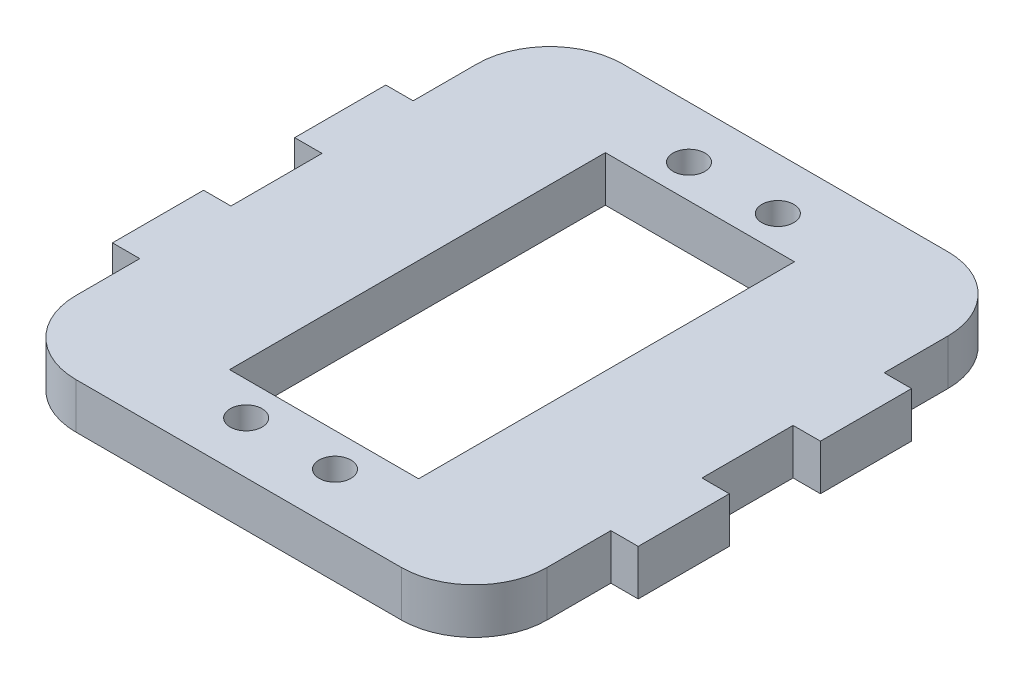
ISO-10303-21;
HEADER;
FILE_DESCRIPTION(('STEP AP214'),'2;1');
FILE_NAME('part.step','',(''),(''),'','','');
FILE_SCHEMA(('AUTOMOTIVE_DESIGN { 1 0 10303 214 1 1 1 1 }'));
ENDSEC;
DATA;
#1=APPLICATION_CONTEXT('core data for automotive mechanical design processes');
#2=APPLICATION_PROTOCOL_DEFINITION('international standard','automotive_design',2000,#1);
#3=PRODUCT_CONTEXT('',#1,'mechanical');
#4=PRODUCT('Part','Part','',(#3));
#5=PRODUCT_RELATED_PRODUCT_CATEGORY('part','',(#4));
#6=PRODUCT_DEFINITION_FORMATION('','',#4);
#7=PRODUCT_DEFINITION_CONTEXT('part definition',#1,'design');
#8=PRODUCT_DEFINITION('design','',#6,#7);
#9=PRODUCT_DEFINITION_SHAPE('','',#8);
#10=(LENGTH_UNIT() NAMED_UNIT(*) SI_UNIT(.MILLI.,.METRE.));
#11=(NAMED_UNIT(*) PLANE_ANGLE_UNIT() SI_UNIT($,.RADIAN.));
#12=(NAMED_UNIT(*) SI_UNIT($,.STERADIAN.) SOLID_ANGLE_UNIT());
#13=UNCERTAINTY_MEASURE_WITH_UNIT(LENGTH_MEASURE(1.E-05),#10,'distance_accuracy_value','');
#14=(GEOMETRIC_REPRESENTATION_CONTEXT(3) GLOBAL_UNCERTAINTY_ASSIGNED_CONTEXT((#13)) GLOBAL_UNIT_ASSIGNED_CONTEXT((#10,
#11,#12)) REPRESENTATION_CONTEXT('',''));
#15=CARTESIAN_POINT('',(0.,0.,0.));
#16=DIRECTION('',(0.,0.,1.));
#17=DIRECTION('',(1.,0.,0.));
#18=AXIS2_PLACEMENT_3D('',#15,#16,#17);
#19=CARTESIAN_POINT('',(0.,5.,0.));
#20=DIRECTION('',(0.,1.,0.));
#21=DIRECTION('',(0.,0.,1.));
#22=AXIS2_PLACEMENT_3D('',#19,#20,#21);
#23=PLANE('',#22);
#24=CARTESIAN_POINT('',(4.87500000000017,5.,-24.3));
#25=DIRECTION('',(0.,1.,0.));
#26=DIRECTION('',(0.,0.,1.));
#27=AXIS2_PLACEMENT_3D('',#24,#25,#26);
#28=CIRCLE('',#27,1.75);
#29=CARTESIAN_POINT('',(4.87500000000017,5.,-22.55));
#30=VERTEX_POINT('',#29);
#31=EDGE_CURVE('E928',#30,#30,#28,.T.);
#32=ORIENTED_EDGE('',*,*,#31,.F.);
#33=EDGE_LOOP('',(#32));
#34=FACE_BOUND('',#33,.T.);
#35=CARTESIAN_POINT('',(-4.875,5.,24.3));
#36=DIRECTION('',(0.,1.,0.));
#37=DIRECTION('',(0.,0.,1.));
#38=AXIS2_PLACEMENT_3D('',#35,#36,#37);
#39=CIRCLE('',#38,1.75);
#40=CARTESIAN_POINT('',(-4.875,5.,26.05));
#41=VERTEX_POINT('',#40);
#42=EDGE_CURVE('E265',#41,#41,#39,.T.);
#43=ORIENTED_EDGE('',*,*,#42,.F.);
#44=EDGE_LOOP('',(#43));
#45=FACE_BOUND('',#44,.T.);
#46=DIRECTION('',(1.,0.,0.));
#47=VECTOR('',#46,1.);
#48=CARTESIAN_POINT('',(25.8500000000002,5.,29.9999999999998));
#49=LINE('',#48,#47);
#50=CARTESIAN_POINT('',(-17.85,5.,30.));
#51=VERTEX_POINT('',#50);
#52=CARTESIAN_POINT('',(17.8500000000002,5.,29.9999999999998));
#53=VERTEX_POINT('',#52);
#54=EDGE_CURVE('E286',#51,#53,#49,.T.);
#55=ORIENTED_EDGE('',*,*,#54,.T.);
#56=CARTESIAN_POINT('',(17.8500000000002,5.,21.9999999999998));
#57=DIRECTION('',(0.,1.,0.));
#58=DIRECTION('',(0.,0.,1.));
#59=AXIS2_PLACEMENT_3D('',#56,#57,#58);
#60=CIRCLE('',#59,8.);
#61=CARTESIAN_POINT('',(25.8500000000002,5.,21.9999999999998));
#62=VERTEX_POINT('',#61);
#63=EDGE_CURVE('E502',#53,#62,#60,.T.);
#64=ORIENTED_EDGE('',*,*,#63,.T.);
#65=DIRECTION('',(0.,0.,-1.));
#66=VECTOR('',#65,1.);
#67=CARTESIAN_POINT('',(25.8500000000002,5.,29.9999999999998));
#68=LINE('',#67,#66);
#69=CARTESIAN_POINT('',(25.8500000000001,5.,14.9999999999998));
#70=VERTEX_POINT('',#69);
#71=EDGE_CURVE('E291',#62,#70,#68,.T.);
#72=ORIENTED_EDGE('',*,*,#71,.T.);
#73=DIRECTION('',(1.,0.,0.));
#74=VECTOR('',#73,1.);
#75=CARTESIAN_POINT('',(25.8500000000001,5.,14.9999999999998));
#76=LINE('',#75,#74);
#77=CARTESIAN_POINT('',(28.8500000000001,5.,14.9999999999998));
#78=VERTEX_POINT('',#77);
#79=EDGE_CURVE('E294',#70,#78,#76,.T.);
#80=ORIENTED_EDGE('',*,*,#79,.T.);
#81=DIRECTION('',(0.,0.,-1.));
#82=VECTOR('',#81,1.);
#83=CARTESIAN_POINT('',(28.8500000000001,5.,14.9999999999998));
#84=LINE('',#83,#82);
#85=CARTESIAN_POINT('',(28.85,5.,4.99999999999978));
#86=VERTEX_POINT('',#85);
#87=EDGE_CURVE('E297',#78,#86,#84,.T.);
#88=ORIENTED_EDGE('',*,*,#87,.T.);
#89=DIRECTION('',(-1.,0.,0.));
#90=VECTOR('',#89,1.);
#91=CARTESIAN_POINT('',(28.85,5.,4.99999999999978));
#92=LINE('',#91,#90);
#93=CARTESIAN_POINT('',(25.85,5.,4.99999999999978));
#94=VERTEX_POINT('',#93);
#95=EDGE_CURVE('E300',#86,#94,#92,.T.);
#96=ORIENTED_EDGE('',*,*,#95,.T.);
#97=DIRECTION('',(0.,0.,-1.));
#98=VECTOR('',#97,1.);
#99=CARTESIAN_POINT('',(25.85,5.,4.99999999999978));
#100=LINE('',#99,#98);
#101=CARTESIAN_POINT('',(25.85,5.,-5.00000000000022));
#102=VERTEX_POINT('',#101);
#103=EDGE_CURVE('E303',#94,#102,#100,.T.);
#104=ORIENTED_EDGE('',*,*,#103,.T.);
#105=DIRECTION('',(1.,0.,0.));
#106=VECTOR('',#105,1.);
#107=CARTESIAN_POINT('',(28.85,5.,-5.00000000000022));
#108=LINE('',#107,#106);
#109=CARTESIAN_POINT('',(28.85,5.,-5.00000000000022));
#110=VERTEX_POINT('',#109);
#111=EDGE_CURVE('E306',#102,#110,#108,.T.);
#112=ORIENTED_EDGE('',*,*,#111,.T.);
#113=DIRECTION('',(0.,0.,-1.));
#114=VECTOR('',#113,1.);
#115=CARTESIAN_POINT('',(28.8499999999999,5.,-15.0000000000002));
#116=LINE('',#115,#114);
#117=CARTESIAN_POINT('',(28.8499999999999,5.,-15.0000000000002));
#118=VERTEX_POINT('',#117);
#119=EDGE_CURVE('E309',#110,#118,#116,.T.);
#120=ORIENTED_EDGE('',*,*,#119,.T.);
#121=DIRECTION('',(-1.,0.,0.));
#122=VECTOR('',#121,1.);
#123=CARTESIAN_POINT('',(25.8499999999999,5.,-15.0000000000002));
#124=LINE('',#123,#122);
#125=CARTESIAN_POINT('',(25.8499999999999,5.,-15.0000000000002));
#126=VERTEX_POINT('',#125);
#127=EDGE_CURVE('E312',#118,#126,#124,.T.);
#128=ORIENTED_EDGE('',*,*,#127,.T.);
#129=DIRECTION('',(0.,0.,-1.));
#130=VECTOR('',#129,1.);
#131=CARTESIAN_POINT('',(25.8499999999999,5.,-15.0000000000002));
#132=LINE('',#131,#130);
#133=CARTESIAN_POINT('',(25.8499999999999,5.,-22.0000000000002));
#134=VERTEX_POINT('',#133);
#135=EDGE_CURVE('E315',#126,#134,#132,.T.);
#136=ORIENTED_EDGE('',*,*,#135,.T.);
#137=CARTESIAN_POINT('',(17.8499999999999,5.,-22.0000000000002));
#138=DIRECTION('',(0.,1.,0.));
#139=DIRECTION('',(0.,0.,1.));
#140=AXIS2_PLACEMENT_3D('',#137,#138,#139);
#141=CIRCLE('',#140,8.);
#142=CARTESIAN_POINT('',(17.8499999999998,5.,-30.0000000000002));
#143=VERTEX_POINT('',#142);
#144=EDGE_CURVE('E494',#134,#143,#141,.T.);
#145=ORIENTED_EDGE('',*,*,#144,.T.);
#146=DIRECTION('',(-1.,0.,0.));
#147=VECTOR('',#146,1.);
#148=CARTESIAN_POINT('',(25.8499999999998,5.,-30.0000000000002));
#149=LINE('',#148,#147);
#150=CARTESIAN_POINT('',(-17.85,5.,-30.));
#151=VERTEX_POINT('',#150);
#152=EDGE_CURVE('E319',#143,#151,#149,.T.);
#153=ORIENTED_EDGE('',*,*,#152,.T.);
#154=CARTESIAN_POINT('',(-17.85,5.,-22.));
#155=DIRECTION('',(0.,1.,0.));
#156=DIRECTION('',(0.,0.,1.));
#157=AXIS2_PLACEMENT_3D('',#154,#155,#156);
#158=CIRCLE('',#157,8.);
#159=CARTESIAN_POINT('',(-25.85,5.,-22.));
#160=VERTEX_POINT('',#159);
#161=EDGE_CURVE('E55',#151,#160,#158,.T.);
#162=ORIENTED_EDGE('',*,*,#161,.T.);
#163=DIRECTION('',(0.,0.,1.));
#164=VECTOR('',#163,1.);
#165=CARTESIAN_POINT('',(-25.85,5.,-15.));
#166=LINE('',#165,#164);
#167=CARTESIAN_POINT('',(-25.85,5.,-15.));
#168=VERTEX_POINT('',#167);
#169=EDGE_CURVE('E322',#160,#168,#166,.T.);
#170=ORIENTED_EDGE('',*,*,#169,.T.);
#171=DIRECTION('',(-1.,0.,0.));
#172=VECTOR('',#171,1.);
#173=CARTESIAN_POINT('',(-25.85,5.,-15.));
#174=LINE('',#173,#172);
#175=CARTESIAN_POINT('',(-28.85,5.,-15.));
#176=VERTEX_POINT('',#175);
#177=EDGE_CURVE('E325',#168,#176,#174,.T.);
#178=ORIENTED_EDGE('',*,*,#177,.T.);
#179=DIRECTION('',(0.,0.,1.));
#180=VECTOR('',#179,1.);
#181=CARTESIAN_POINT('',(-28.85,5.,-15.));
#182=LINE('',#181,#180);
#183=CARTESIAN_POINT('',(-28.85,5.,-5.));
#184=VERTEX_POINT('',#183);
#185=EDGE_CURVE('E328',#176,#184,#182,.T.);
#186=ORIENTED_EDGE('',*,*,#185,.T.);
#187=DIRECTION('',(1.,0.,0.));
#188=VECTOR('',#187,1.);
#189=CARTESIAN_POINT('',(-28.85,5.,-5.));
#190=LINE('',#189,#188);
#191=CARTESIAN_POINT('',(-25.85,5.,-5.));
#192=VERTEX_POINT('',#191);
#193=EDGE_CURVE('E331',#184,#192,#190,.T.);
#194=ORIENTED_EDGE('',*,*,#193,.T.);
#195=DIRECTION('',(0.,0.,1.));
#196=VECTOR('',#195,1.);
#197=CARTESIAN_POINT('',(-25.85,5.,5.));
#198=LINE('',#197,#196);
#199=CARTESIAN_POINT('',(-25.85,5.,5.));
#200=VERTEX_POINT('',#199);
#201=EDGE_CURVE('E334',#192,#200,#198,.T.);
#202=ORIENTED_EDGE('',*,*,#201,.T.);
#203=DIRECTION('',(-1.,0.,0.));
#204=VECTOR('',#203,1.);
#205=CARTESIAN_POINT('',(-28.85,5.,5.));
#206=LINE('',#205,#204);
#207=CARTESIAN_POINT('',(-28.85,5.,5.));
#208=VERTEX_POINT('',#207);
#209=EDGE_CURVE('E337',#200,#208,#206,.T.);
#210=ORIENTED_EDGE('',*,*,#209,.T.);
#211=DIRECTION('',(0.,0.,1.));
#212=VECTOR('',#211,1.);
#213=CARTESIAN_POINT('',(-28.85,5.,15.));
#214=LINE('',#213,#212);
#215=CARTESIAN_POINT('',(-28.85,5.,15.));
#216=VERTEX_POINT('',#215);
#217=EDGE_CURVE('E340',#208,#216,#214,.T.);
#218=ORIENTED_EDGE('',*,*,#217,.T.);
#219=DIRECTION('',(1.,0.,0.));
#220=VECTOR('',#219,1.);
#221=CARTESIAN_POINT('',(-25.85,5.,15.));
#222=LINE('',#221,#220);
#223=CARTESIAN_POINT('',(-25.85,5.,15.));
#224=VERTEX_POINT('',#223);
#225=EDGE_CURVE('E343',#216,#224,#222,.T.);
#226=ORIENTED_EDGE('',*,*,#225,.T.);
#227=DIRECTION('',(0.,0.,1.));
#228=VECTOR('',#227,1.);
#229=CARTESIAN_POINT('',(-25.85,5.,30.));
#230=LINE('',#229,#228);
#231=CARTESIAN_POINT('',(-25.85,5.,22.));
#232=VERTEX_POINT('',#231);
#233=EDGE_CURVE('E282',#224,#232,#230,.T.);
#234=ORIENTED_EDGE('',*,*,#233,.T.);
#235=CARTESIAN_POINT('',(-17.85,5.,22.));
#236=DIRECTION('',(0.,1.,0.));
#237=DIRECTION('',(0.,0.,1.));
#238=AXIS2_PLACEMENT_3D('',#235,#236,#237);
#239=CIRCLE('',#238,8.);
#240=EDGE_CURVE('E499',#232,#51,#239,.T.);
#241=ORIENTED_EDGE('',*,*,#240,.T.);
#242=EDGE_LOOP('',(#55,#64,#72,#80,#88,#96,#104,#112,#120,#128,#136,#145,#153,#162,#170,#178,
#186,#194,#202,#210,#218,#226,#234,#241));
#243=FACE_BOUND('',#242,.T.);
#244=DIRECTION('',(-1.,0.,0.));
#245=VECTOR('',#244,1.);
#246=CARTESIAN_POINT('',(-10.375,5.,-20.625));
#247=LINE('',#246,#245);
#248=CARTESIAN_POINT('',(10.3749999999999,5.,-20.6250000000001));
#249=VERTEX_POINT('',#248);
#250=CARTESIAN_POINT('',(-10.375,5.,-20.625));
#251=VERTEX_POINT('',#250);
#252=EDGE_CURVE('E237',#249,#251,#247,.T.);
#253=ORIENTED_EDGE('',*,*,#252,.F.);
#254=DIRECTION('',(0.,0.,-1.));
#255=VECTOR('',#254,1.);
#256=CARTESIAN_POINT('',(10.3749999999999,5.,-20.6250000000001));
#257=LINE('',#256,#255);
#258=CARTESIAN_POINT('',(10.3750000000001,5.,20.6249999999999));
#259=VERTEX_POINT('',#258);
#260=EDGE_CURVE('E226',#259,#249,#257,.T.);
#261=ORIENTED_EDGE('',*,*,#260,.F.);
#262=DIRECTION('',(1.,0.,0.));
#263=VECTOR('',#262,1.);
#264=CARTESIAN_POINT('',(-10.375,5.,20.625));
#265=LINE('',#264,#263);
#266=CARTESIAN_POINT('',(-10.375,5.,20.625));
#267=VERTEX_POINT('',#266);
#268=EDGE_CURVE('E256',#267,#259,#265,.T.);
#269=ORIENTED_EDGE('',*,*,#268,.F.);
#270=DIRECTION('',(0.,0.,1.));
#271=VECTOR('',#270,1.);
#272=CARTESIAN_POINT('',(-10.375,5.,-20.625));
#273=LINE('',#272,#271);
#274=EDGE_CURVE('E252',#251,#267,#273,.T.);
#275=ORIENTED_EDGE('',*,*,#274,.F.);
#276=EDGE_LOOP('',(#253,#261,#269,#275));
#277=FACE_BOUND('',#276,.T.);
#278=CARTESIAN_POINT('',(4.87500000000017,5.,24.3));
#279=DIRECTION('',(0.,1.,0.));
#280=DIRECTION('',(0.,0.,-1.));
#281=AXIS2_PLACEMENT_3D('',#278,#279,#280);
#282=CIRCLE('',#281,1.75);
#283=CARTESIAN_POINT('',(4.87500000000017,5.,22.55));
#284=VERTEX_POINT('',#283);
#285=EDGE_CURVE('E936',#284,#284,#282,.T.);
#286=ORIENTED_EDGE('',*,*,#285,.F.);
#287=EDGE_LOOP('',(#286));
#288=FACE_BOUND('',#287,.T.);
#289=CARTESIAN_POINT('',(-4.875,5.,-24.3));
#290=DIRECTION('',(0.,1.,0.));
#291=DIRECTION('',(0.,0.,-1.));
#292=AXIS2_PLACEMENT_3D('',#289,#290,#291);
#293=CIRCLE('',#292,1.75);
#294=CARTESIAN_POINT('',(-4.875,5.,-26.05));
#295=VERTEX_POINT('',#294);
#296=EDGE_CURVE('E917',#295,#295,#293,.T.);
#297=ORIENTED_EDGE('',*,*,#296,.F.);
#298=EDGE_LOOP('',(#297));
#299=FACE_BOUND('',#298,.T.);
#300=ADVANCED_FACE('F39',(#34,#45,#243,#277,#288,#299),#23,.T.);
#301=CARTESIAN_POINT('',(0.,0.,0.));
#302=DIRECTION('',(0.,1.,0.));
#303=DIRECTION('',(0.,0.,1.));
#304=AXIS2_PLACEMENT_3D('',#301,#302,#303);
#305=PLANE('',#304);
#306=DIRECTION('',(0.,0.,-1.));
#307=VECTOR('',#306,1.);
#308=CARTESIAN_POINT('',(25.8500000000002,0.,29.9999999999998));
#309=LINE('',#308,#307);
#310=CARTESIAN_POINT('',(25.8500000000002,0.,21.9999999999998));
#311=VERTEX_POINT('',#310);
#312=CARTESIAN_POINT('',(25.8500000000001,0.,14.9999999999998));
#313=VERTEX_POINT('',#312);
#314=EDGE_CURVE('E354',#311,#313,#309,.T.);
#315=ORIENTED_EDGE('',*,*,#314,.F.);
#316=CARTESIAN_POINT('',(17.8500000000002,0.,21.9999999999998));
#317=DIRECTION('',(0.,1.,0.));
#318=DIRECTION('',(0.,0.,1.));
#319=AXIS2_PLACEMENT_3D('',#316,#317,#318);
#320=CIRCLE('',#319,8.);
#321=CARTESIAN_POINT('',(17.8500000000002,0.,29.9999999999998));
#322=VERTEX_POINT('',#321);
#323=EDGE_CURVE('E484',#311,#322,#320,.F.);
#324=ORIENTED_EDGE('',*,*,#323,.T.);
#325=DIRECTION('',(1.,0.,0.));
#326=VECTOR('',#325,1.);
#327=CARTESIAN_POINT('',(25.8500000000002,0.,29.9999999999998));
#328=LINE('',#327,#326);
#329=CARTESIAN_POINT('',(-17.85,0.,30.));
#330=VERTEX_POINT('',#329);
#331=EDGE_CURVE('E350',#330,#322,#328,.T.);
#332=ORIENTED_EDGE('',*,*,#331,.F.);
#333=CARTESIAN_POINT('',(-17.85,0.,22.));
#334=DIRECTION('',(0.,1.,0.));
#335=DIRECTION('',(0.,0.,1.));
#336=AXIS2_PLACEMENT_3D('',#333,#334,#335);
#337=CIRCLE('',#336,8.);
#338=CARTESIAN_POINT('',(-25.85,0.,22.));
#339=VERTEX_POINT('',#338);
#340=EDGE_CURVE('E481',#330,#339,#337,.F.);
#341=ORIENTED_EDGE('',*,*,#340,.T.);
#342=DIRECTION('',(0.,0.,1.));
#343=VECTOR('',#342,1.);
#344=CARTESIAN_POINT('',(-25.85,0.,30.));
#345=LINE('',#344,#343);
#346=CARTESIAN_POINT('',(-25.85,0.,15.));
#347=VERTEX_POINT('',#346);
#348=EDGE_CURVE('E246',#347,#339,#345,.T.);
#349=ORIENTED_EDGE('',*,*,#348,.F.);
#350=DIRECTION('',(1.,0.,0.));
#351=VECTOR('',#350,1.);
#352=CARTESIAN_POINT('',(-25.85,0.,15.));
#353=LINE('',#352,#351);
#354=CARTESIAN_POINT('',(-28.85,0.,15.));
#355=VERTEX_POINT('',#354);
#356=EDGE_CURVE('E287',#355,#347,#353,.T.);
#357=ORIENTED_EDGE('',*,*,#356,.F.);
#358=DIRECTION('',(0.,0.,1.));
#359=VECTOR('',#358,1.);
#360=CARTESIAN_POINT('',(-28.85,0.,15.));
#361=LINE('',#360,#359);
#362=CARTESIAN_POINT('',(-28.85,0.,5.));
#363=VERTEX_POINT('',#362);
#364=EDGE_CURVE('E403',#363,#355,#361,.T.);
#365=ORIENTED_EDGE('',*,*,#364,.F.);
#366=DIRECTION('',(-1.,0.,0.));
#367=VECTOR('',#366,1.);
#368=CARTESIAN_POINT('',(-28.85,0.,5.));
#369=LINE('',#368,#367);
#370=CARTESIAN_POINT('',(-25.85,0.,5.));
#371=VERTEX_POINT('',#370);
#372=EDGE_CURVE('E400',#371,#363,#369,.T.);
#373=ORIENTED_EDGE('',*,*,#372,.F.);
#374=DIRECTION('',(0.,0.,1.));
#375=VECTOR('',#374,1.);
#376=CARTESIAN_POINT('',(-25.85,0.,5.));
#377=LINE('',#376,#375);
#378=CARTESIAN_POINT('',(-25.85,0.,-5.));
#379=VERTEX_POINT('',#378);
#380=EDGE_CURVE('E397',#379,#371,#377,.T.);
#381=ORIENTED_EDGE('',*,*,#380,.F.);
#382=DIRECTION('',(1.,0.,0.));
#383=VECTOR('',#382,1.);
#384=CARTESIAN_POINT('',(-28.85,0.,-5.));
#385=LINE('',#384,#383);
#386=CARTESIAN_POINT('',(-28.85,0.,-5.));
#387=VERTEX_POINT('',#386);
#388=EDGE_CURVE('E394',#387,#379,#385,.T.);
#389=ORIENTED_EDGE('',*,*,#388,.F.);
#390=DIRECTION('',(0.,0.,1.));
#391=VECTOR('',#390,1.);
#392=CARTESIAN_POINT('',(-28.85,0.,-15.));
#393=LINE('',#392,#391);
#394=CARTESIAN_POINT('',(-28.85,0.,-15.));
#395=VERTEX_POINT('',#394);
#396=EDGE_CURVE('E391',#395,#387,#393,.T.);
#397=ORIENTED_EDGE('',*,*,#396,.F.);
#398=DIRECTION('',(-1.,0.,0.));
#399=VECTOR('',#398,1.);
#400=CARTESIAN_POINT('',(-25.85,0.,-15.));
#401=LINE('',#400,#399);
#402=CARTESIAN_POINT('',(-25.85,0.,-15.));
#403=VERTEX_POINT('',#402);
#404=EDGE_CURVE('E388',#403,#395,#401,.T.);
#405=ORIENTED_EDGE('',*,*,#404,.F.);
#406=DIRECTION('',(0.,0.,1.));
#407=VECTOR('',#406,1.);
#408=CARTESIAN_POINT('',(-25.85,0.,-15.));
#409=LINE('',#408,#407);
#410=CARTESIAN_POINT('',(-25.85,0.,-22.));
#411=VERTEX_POINT('',#410);
#412=EDGE_CURVE('E385',#411,#403,#409,.T.);
#413=ORIENTED_EDGE('',*,*,#412,.F.);
#414=CARTESIAN_POINT('',(-17.85,0.,-22.));
#415=DIRECTION('',(0.,1.,0.));
#416=DIRECTION('',(0.,0.,1.));
#417=AXIS2_PLACEMENT_3D('',#414,#415,#416);
#418=CIRCLE('',#417,8.);
#419=CARTESIAN_POINT('',(-17.85,0.,-30.));
#420=VERTEX_POINT('',#419);
#421=EDGE_CURVE('E478',#411,#420,#418,.F.);
#422=ORIENTED_EDGE('',*,*,#421,.T.);
#423=DIRECTION('',(-1.,0.,0.));
#424=VECTOR('',#423,1.);
#425=CARTESIAN_POINT('',(25.8499999999998,0.,-30.0000000000002));
#426=LINE('',#425,#424);
#427=CARTESIAN_POINT('',(17.8499999999998,0.,-30.0000000000002));
#428=VERTEX_POINT('',#427);
#429=EDGE_CURVE('E382',#428,#420,#426,.T.);
#430=ORIENTED_EDGE('',*,*,#429,.F.);
#431=CARTESIAN_POINT('',(17.8499999999999,0.,-22.0000000000002));
#432=DIRECTION('',(0.,1.,0.));
#433=DIRECTION('',(0.,0.,1.));
#434=AXIS2_PLACEMENT_3D('',#431,#432,#433);
#435=CIRCLE('',#434,8.);
#436=CARTESIAN_POINT('',(25.8499999999999,0.,-22.0000000000002));
#437=VERTEX_POINT('',#436);
#438=EDGE_CURVE('E475',#428,#437,#435,.F.);
#439=ORIENTED_EDGE('',*,*,#438,.T.);
#440=DIRECTION('',(0.,0.,-1.));
#441=VECTOR('',#440,1.);
#442=CARTESIAN_POINT('',(25.8499999999999,0.,-15.0000000000002));
#443=LINE('',#442,#441);
#444=CARTESIAN_POINT('',(25.8499999999999,0.,-15.0000000000002));
#445=VERTEX_POINT('',#444);
#446=EDGE_CURVE('E378',#445,#437,#443,.T.);
#447=ORIENTED_EDGE('',*,*,#446,.F.);
#448=DIRECTION('',(-1.,0.,0.));
#449=VECTOR('',#448,1.);
#450=CARTESIAN_POINT('',(25.8499999999999,0.,-15.0000000000002));
#451=LINE('',#450,#449);
#452=CARTESIAN_POINT('',(28.8499999999999,0.,-15.0000000000002));
#453=VERTEX_POINT('',#452);
#454=EDGE_CURVE('E375',#453,#445,#451,.T.);
#455=ORIENTED_EDGE('',*,*,#454,.F.);
#456=DIRECTION('',(0.,0.,-1.));
#457=VECTOR('',#456,1.);
#458=CARTESIAN_POINT('',(28.8499999999999,0.,-15.0000000000002));
#459=LINE('',#458,#457);
#460=CARTESIAN_POINT('',(28.85,0.,-5.00000000000022));
#461=VERTEX_POINT('',#460);
#462=EDGE_CURVE('E372',#461,#453,#459,.T.);
#463=ORIENTED_EDGE('',*,*,#462,.F.);
#464=DIRECTION('',(1.,0.,0.));
#465=VECTOR('',#464,1.);
#466=CARTESIAN_POINT('',(28.85,0.,-5.00000000000022));
#467=LINE('',#466,#465);
#468=CARTESIAN_POINT('',(25.85,0.,-5.00000000000022));
#469=VERTEX_POINT('',#468);
#470=EDGE_CURVE('E369',#469,#461,#467,.T.);
#471=ORIENTED_EDGE('',*,*,#470,.F.);
#472=DIRECTION('',(0.,0.,-1.));
#473=VECTOR('',#472,1.);
#474=CARTESIAN_POINT('',(25.85,0.,4.99999999999978));
#475=LINE('',#474,#473);
#476=CARTESIAN_POINT('',(25.85,0.,4.99999999999978));
#477=VERTEX_POINT('',#476);
#478=EDGE_CURVE('E366',#477,#469,#475,.T.);
#479=ORIENTED_EDGE('',*,*,#478,.F.);
#480=DIRECTION('',(-1.,0.,0.));
#481=VECTOR('',#480,1.);
#482=CARTESIAN_POINT('',(28.85,0.,4.99999999999978));
#483=LINE('',#482,#481);
#484=CARTESIAN_POINT('',(28.85,0.,4.99999999999978));
#485=VERTEX_POINT('',#484);
#486=EDGE_CURVE('E363',#485,#477,#483,.T.);
#487=ORIENTED_EDGE('',*,*,#486,.F.);
#488=DIRECTION('',(0.,0.,-1.));
#489=VECTOR('',#488,1.);
#490=CARTESIAN_POINT('',(28.8500000000001,0.,14.9999999999998));
#491=LINE('',#490,#489);
#492=CARTESIAN_POINT('',(28.8500000000001,0.,14.9999999999998));
#493=VERTEX_POINT('',#492);
#494=EDGE_CURVE('E360',#493,#485,#491,.T.);
#495=ORIENTED_EDGE('',*,*,#494,.F.);
#496=DIRECTION('',(1.,0.,0.));
#497=VECTOR('',#496,1.);
#498=CARTESIAN_POINT('',(25.8500000000001,0.,14.9999999999998));
#499=LINE('',#498,#497);
#500=EDGE_CURVE('E357',#313,#493,#499,.T.);
#501=ORIENTED_EDGE('',*,*,#500,.F.);
#502=EDGE_LOOP('',(#315,#324,#332,#341,#349,#357,#365,#373,#381,#389,#397,#405,#413,#422,#430,
#439,#447,#455,#463,#471,#479,#487,#495,#501));
#503=FACE_BOUND('',#502,.T.);
#504=DIRECTION('',(0.,0.,-1.));
#505=VECTOR('',#504,1.);
#506=CARTESIAN_POINT('',(10.3749999999999,0.,-20.6250000000001));
#507=LINE('',#506,#505);
#508=CARTESIAN_POINT('',(10.3750000000001,0.,20.6249999999999));
#509=VERTEX_POINT('',#508);
#510=CARTESIAN_POINT('',(10.3749999999999,0.,-20.6250000000001));
#511=VERTEX_POINT('',#510);
#512=EDGE_CURVE('E262',#509,#511,#507,.T.);
#513=ORIENTED_EDGE('',*,*,#512,.T.);
#514=DIRECTION('',(-1.,0.,0.));
#515=VECTOR('',#514,1.);
#516=CARTESIAN_POINT('',(-10.375,0.,-20.625));
#517=LINE('',#516,#515);
#518=CARTESIAN_POINT('',(-10.375,0.,-20.625));
#519=VERTEX_POINT('',#518);
#520=EDGE_CURVE('E244',#511,#519,#517,.T.);
#521=ORIENTED_EDGE('',*,*,#520,.T.);
#522=DIRECTION('',(0.,0.,1.));
#523=VECTOR('',#522,1.);
#524=CARTESIAN_POINT('',(-10.375,0.,-20.625));
#525=LINE('',#524,#523);
#526=CARTESIAN_POINT('',(-10.375,0.,20.625));
#527=VERTEX_POINT('',#526);
#528=EDGE_CURVE('E268',#519,#527,#525,.T.);
#529=ORIENTED_EDGE('',*,*,#528,.T.);
#530=DIRECTION('',(1.,0.,0.));
#531=VECTOR('',#530,1.);
#532=CARTESIAN_POINT('',(-10.375,0.,20.625));
#533=LINE('',#532,#531);
#534=EDGE_CURVE('E238',#527,#509,#533,.T.);
#535=ORIENTED_EDGE('',*,*,#534,.T.);
#536=EDGE_LOOP('',(#513,#521,#529,#535));
#537=FACE_BOUND('',#536,.T.);
#538=CARTESIAN_POINT('',(-4.875,0.,24.3));
#539=DIRECTION('',(0.,1.,0.));
#540=DIRECTION('',(0.,0.,1.));
#541=AXIS2_PLACEMENT_3D('',#538,#539,#540);
#542=CIRCLE('',#541,1.75);
#543=CARTESIAN_POINT('',(-4.875,0.,26.05));
#544=VERTEX_POINT('',#543);
#545=EDGE_CURVE('E940',#544,#544,#542,.T.);
#546=ORIENTED_EDGE('',*,*,#545,.T.);
#547=EDGE_LOOP('',(#546));
#548=FACE_BOUND('',#547,.T.);
#549=CARTESIAN_POINT('',(4.87500000000017,0.,24.3));
#550=DIRECTION('',(0.,1.,0.));
#551=DIRECTION('',(0.,0.,-1.));
#552=AXIS2_PLACEMENT_3D('',#549,#550,#551);
#553=CIRCLE('',#552,1.75);
#554=CARTESIAN_POINT('',(4.87500000000017,0.,22.55));
#555=VERTEX_POINT('',#554);
#556=EDGE_CURVE('E932',#555,#555,#553,.T.);
#557=ORIENTED_EDGE('',*,*,#556,.T.);
#558=EDGE_LOOP('',(#557));
#559=FACE_BOUND('',#558,.T.);
#560=CARTESIAN_POINT('',(4.87500000000017,0.,-24.3));
#561=DIRECTION('',(0.,1.,0.));
#562=DIRECTION('',(0.,0.,1.));
#563=AXIS2_PLACEMENT_3D('',#560,#561,#562);
#564=CIRCLE('',#563,1.75);
#565=CARTESIAN_POINT('',(4.87500000000017,0.,-22.55));
#566=VERTEX_POINT('',#565);
#567=EDGE_CURVE('E925',#566,#566,#564,.T.);
#568=ORIENTED_EDGE('',*,*,#567,.T.);
#569=EDGE_LOOP('',(#568));
#570=FACE_BOUND('',#569,.T.);
#571=CARTESIAN_POINT('',(-4.875,0.,-24.3));
#572=DIRECTION('',(0.,1.,0.));
#573=DIRECTION('',(0.,0.,-1.));
#574=AXIS2_PLACEMENT_3D('',#571,#572,#573);
#575=CIRCLE('',#574,1.75);
#576=CARTESIAN_POINT('',(-4.875,0.,-26.05));
#577=VERTEX_POINT('',#576);
#578=EDGE_CURVE('E920',#577,#577,#575,.T.);
#579=ORIENTED_EDGE('',*,*,#578,.T.);
#580=EDGE_LOOP('',(#579));
#581=FACE_BOUND('',#580,.T.);
#582=ADVANCED_FACE('F523',(#503,#537,#548,#559,#570,#581),#305,.F.);
#583=CARTESIAN_POINT('',(-25.85,5.,30.));
#584=DIRECTION('',(1.,0.,0.));
#585=DIRECTION('',(0.,0.,-1.));
#586=AXIS2_PLACEMENT_3D('',#583,#584,#585);
#587=PLANE('',#586);
#588=ORIENTED_EDGE('',*,*,#348,.T.);
#589=DIRECTION('',(0.,-1.,0.));
#590=VECTOR('',#589,1.);
#591=CARTESIAN_POINT('',(-25.85,5.,22.));
#592=LINE('',#591,#590);
#593=EDGE_CURVE('E505',#339,#232,#592,.F.);
#594=ORIENTED_EDGE('',*,*,#593,.T.);
#595=ORIENTED_EDGE('',*,*,#233,.F.);
#596=DIRECTION('',(0.,-1.,0.));
#597=VECTOR('',#596,1.);
#598=CARTESIAN_POINT('',(-25.85,5.,15.));
#599=LINE('',#598,#597);
#600=EDGE_CURVE('E346',#224,#347,#599,.T.);
#601=ORIENTED_EDGE('',*,*,#600,.T.);
#602=EDGE_LOOP('',(#588,#594,#595,#601));
#603=FACE_BOUND('',#602,.T.);
#604=ADVANCED_FACE('F572',(#603),#587,.F.);
#605=CARTESIAN_POINT('',(25.8500000000002,5.,29.9999999999998));
#606=DIRECTION('',(0.,0.,-1.));
#607=DIRECTION('',(-1.,0.,0.));
#608=AXIS2_PLACEMENT_3D('',#605,#606,#607);
#609=PLANE('',#608);
#610=ORIENTED_EDGE('',*,*,#331,.T.);
#611=DIRECTION('',(0.,-1.,0.));
#612=VECTOR('',#611,1.);
#613=CARTESIAN_POINT('',(17.8500000000002,5.,29.9999999999998));
#614=LINE('',#613,#612);
#615=EDGE_CURVE('E491',#322,#53,#614,.F.);
#616=ORIENTED_EDGE('',*,*,#615,.T.);
#617=ORIENTED_EDGE('',*,*,#54,.F.);
#618=DIRECTION('',(0.,-1.,0.));
#619=VECTOR('',#618,1.);
#620=CARTESIAN_POINT('',(-17.85,5.,30.));
#621=LINE('',#620,#619);
#622=EDGE_CURVE('E487',#51,#330,#621,.T.);
#623=ORIENTED_EDGE('',*,*,#622,.T.);
#624=EDGE_LOOP('',(#610,#616,#617,#623));
#625=FACE_BOUND('',#624,.T.);
#626=ADVANCED_FACE('F580',(#625),#609,.F.);
#627=CARTESIAN_POINT('',(25.8500000000002,5.,29.9999999999998));
#628=DIRECTION('',(-1.,0.,0.));
#629=DIRECTION('',(0.,0.,1.));
#630=AXIS2_PLACEMENT_3D('',#627,#628,#629);
#631=PLANE('',#630);
#632=ORIENTED_EDGE('',*,*,#71,.F.);
#633=DIRECTION('',(0.,-1.,0.));
#634=VECTOR('',#633,1.);
#635=CARTESIAN_POINT('',(25.8500000000002,5.,21.9999999999998));
#636=LINE('',#635,#634);
#637=EDGE_CURVE('E471',#62,#311,#636,.T.);
#638=ORIENTED_EDGE('',*,*,#637,.T.);
#639=ORIENTED_EDGE('',*,*,#314,.T.);
#640=DIRECTION('',(0.,-1.,0.));
#641=VECTOR('',#640,1.);
#642=CARTESIAN_POINT('',(25.8500000000001,5.,14.9999999999998));
#643=LINE('',#642,#641);
#644=EDGE_CURVE('E467',#70,#313,#643,.T.);
#645=ORIENTED_EDGE('',*,*,#644,.F.);
#646=EDGE_LOOP('',(#632,#638,#639,#645));
#647=FACE_BOUND('',#646,.T.);
#648=ADVANCED_FACE('F589',(#647),#631,.F.);
#649=CARTESIAN_POINT('',(25.8500000000001,5.,14.9999999999998));
#650=DIRECTION('',(0.,0.,-1.));
#651=DIRECTION('',(-1.,0.,0.));
#652=AXIS2_PLACEMENT_3D('',#649,#650,#651);
#653=PLANE('',#652);
#654=ORIENTED_EDGE('',*,*,#500,.T.);
#655=DIRECTION('',(0.,-1.,0.));
#656=VECTOR('',#655,1.);
#657=CARTESIAN_POINT('',(28.8500000000001,5.,14.9999999999998));
#658=LINE('',#657,#656);
#659=EDGE_CURVE('E463',#78,#493,#658,.T.);
#660=ORIENTED_EDGE('',*,*,#659,.F.);
#661=ORIENTED_EDGE('',*,*,#79,.F.);
#662=ORIENTED_EDGE('',*,*,#644,.T.);
#663=EDGE_LOOP('',(#654,#660,#661,#662));
#664=FACE_BOUND('',#663,.T.);
#665=ADVANCED_FACE('F594',(#664),#653,.F.);
#666=CARTESIAN_POINT('',(28.8500000000001,5.,14.9999999999998));
#667=DIRECTION('',(-1.,0.,0.));
#668=DIRECTION('',(0.,0.,1.));
#669=AXIS2_PLACEMENT_3D('',#666,#667,#668);
#670=PLANE('',#669);
#671=ORIENTED_EDGE('',*,*,#494,.T.);
#672=DIRECTION('',(0.,-1.,0.));
#673=VECTOR('',#672,1.);
#674=CARTESIAN_POINT('',(28.85,5.,4.99999999999978));
#675=LINE('',#674,#673);
#676=EDGE_CURVE('E459',#86,#485,#675,.T.);
#677=ORIENTED_EDGE('',*,*,#676,.F.);
#678=ORIENTED_EDGE('',*,*,#87,.F.);
#679=ORIENTED_EDGE('',*,*,#659,.T.);
#680=EDGE_LOOP('',(#671,#677,#678,#679));
#681=FACE_BOUND('',#680,.T.);
#682=ADVANCED_FACE('F600',(#681),#670,.F.);
#683=CARTESIAN_POINT('',(28.85,5.,4.99999999999978));
#684=DIRECTION('',(0.,0.,1.));
#685=DIRECTION('',(1.,0.,0.));
#686=AXIS2_PLACEMENT_3D('',#683,#684,#685);
#687=PLANE('',#686);
#688=ORIENTED_EDGE('',*,*,#486,.T.);
#689=DIRECTION('',(0.,-1.,0.));
#690=VECTOR('',#689,1.);
#691=CARTESIAN_POINT('',(25.85,5.,4.99999999999978));
#692=LINE('',#691,#690);
#693=EDGE_CURVE('E455',#94,#477,#692,.T.);
#694=ORIENTED_EDGE('',*,*,#693,.F.);
#695=ORIENTED_EDGE('',*,*,#95,.F.);
#696=ORIENTED_EDGE('',*,*,#676,.T.);
#697=EDGE_LOOP('',(#688,#694,#695,#696));
#698=FACE_BOUND('',#697,.T.);
#699=ADVANCED_FACE('F604',(#698),#687,.F.);
#700=CARTESIAN_POINT('',(25.85,5.,4.99999999999978));
#701=DIRECTION('',(-1.,0.,0.));
#702=DIRECTION('',(0.,0.,1.));
#703=AXIS2_PLACEMENT_3D('',#700,#701,#702);
#704=PLANE('',#703);
#705=ORIENTED_EDGE('',*,*,#478,.T.);
#706=DIRECTION('',(0.,-1.,0.));
#707=VECTOR('',#706,1.);
#708=CARTESIAN_POINT('',(25.85,5.,-5.00000000000022));
#709=LINE('',#708,#707);
#710=EDGE_CURVE('E451',#102,#469,#709,.T.);
#711=ORIENTED_EDGE('',*,*,#710,.F.);
#712=ORIENTED_EDGE('',*,*,#103,.F.);
#713=ORIENTED_EDGE('',*,*,#693,.T.);
#714=EDGE_LOOP('',(#705,#711,#712,#713));
#715=FACE_BOUND('',#714,.T.);
#716=ADVANCED_FACE('F609',(#715),#704,.F.);
#717=CARTESIAN_POINT('',(28.85,5.,-5.00000000000022));
#718=DIRECTION('',(0.,0.,-1.));
#719=DIRECTION('',(-1.,0.,0.));
#720=AXIS2_PLACEMENT_3D('',#717,#718,#719);
#721=PLANE('',#720);
#722=ORIENTED_EDGE('',*,*,#470,.T.);
#723=DIRECTION('',(0.,-1.,0.));
#724=VECTOR('',#723,1.);
#725=CARTESIAN_POINT('',(28.85,5.,-5.00000000000022));
#726=LINE('',#725,#724);
#727=EDGE_CURVE('E447',#110,#461,#726,.T.);
#728=ORIENTED_EDGE('',*,*,#727,.F.);
#729=ORIENTED_EDGE('',*,*,#111,.F.);
#730=ORIENTED_EDGE('',*,*,#710,.T.);
#731=EDGE_LOOP('',(#722,#728,#729,#730));
#732=FACE_BOUND('',#731,.T.);
#733=ADVANCED_FACE('F615',(#732),#721,.F.);
#734=CARTESIAN_POINT('',(28.8499999999999,5.,-15.0000000000002));
#735=DIRECTION('',(-1.,0.,0.));
#736=DIRECTION('',(0.,0.,1.));
#737=AXIS2_PLACEMENT_3D('',#734,#735,#736);
#738=PLANE('',#737);
#739=ORIENTED_EDGE('',*,*,#462,.T.);
#740=DIRECTION('',(0.,-1.,0.));
#741=VECTOR('',#740,1.);
#742=CARTESIAN_POINT('',(28.8499999999999,5.,-15.0000000000002));
#743=LINE('',#742,#741);
#744=EDGE_CURVE('E443',#118,#453,#743,.T.);
#745=ORIENTED_EDGE('',*,*,#744,.F.);
#746=ORIENTED_EDGE('',*,*,#119,.F.);
#747=ORIENTED_EDGE('',*,*,#727,.T.);
#748=EDGE_LOOP('',(#739,#745,#746,#747));
#749=FACE_BOUND('',#748,.T.);
#750=ADVANCED_FACE('F619',(#749),#738,.F.);
#751=CARTESIAN_POINT('',(25.8499999999999,5.,-15.0000000000002));
#752=DIRECTION('',(0.,0.,1.));
#753=DIRECTION('',(1.,0.,0.));
#754=AXIS2_PLACEMENT_3D('',#751,#752,#753);
#755=PLANE('',#754);
#756=ORIENTED_EDGE('',*,*,#454,.T.);
#757=DIRECTION('',(0.,-1.,0.));
#758=VECTOR('',#757,1.);
#759=CARTESIAN_POINT('',(25.8499999999999,5.,-15.0000000000002));
#760=LINE('',#759,#758);
#761=EDGE_CURVE('E439',#126,#445,#760,.T.);
#762=ORIENTED_EDGE('',*,*,#761,.F.);
#763=ORIENTED_EDGE('',*,*,#127,.F.);
#764=ORIENTED_EDGE('',*,*,#744,.T.);
#765=EDGE_LOOP('',(#756,#762,#763,#764));
#766=FACE_BOUND('',#765,.T.);
#767=ADVANCED_FACE('F624',(#766),#755,.F.);
#768=CARTESIAN_POINT('',(25.8499999999999,5.,-15.0000000000002));
#769=DIRECTION('',(-1.,0.,0.));
#770=DIRECTION('',(0.,0.,1.));
#771=AXIS2_PLACEMENT_3D('',#768,#769,#770);
#772=PLANE('',#771);
#773=ORIENTED_EDGE('',*,*,#446,.T.);
#774=DIRECTION('',(0.,-1.,0.));
#775=VECTOR('',#774,1.);
#776=CARTESIAN_POINT('',(25.8499999999999,5.,-22.0000000000002));
#777=LINE('',#776,#775);
#778=EDGE_CURVE('E11',#437,#134,#777,.F.);
#779=ORIENTED_EDGE('',*,*,#778,.T.);
#780=ORIENTED_EDGE('',*,*,#135,.F.);
#781=ORIENTED_EDGE('',*,*,#761,.T.);
#782=EDGE_LOOP('',(#773,#779,#780,#781));
#783=FACE_BOUND('',#782,.T.);
#784=ADVANCED_FACE('F628',(#783),#772,.F.);
#785=CARTESIAN_POINT('',(25.8499999999998,5.,-30.0000000000002));
#786=DIRECTION('',(0.,0.,1.));
#787=DIRECTION('',(1.,0.,0.));
#788=AXIS2_PLACEMENT_3D('',#785,#786,#787);
#789=PLANE('',#788);
#790=ORIENTED_EDGE('',*,*,#429,.T.);
#791=DIRECTION('',(0.,-1.,0.));
#792=VECTOR('',#791,1.);
#793=CARTESIAN_POINT('',(-17.85,5.,-30.));
#794=LINE('',#793,#792);
#795=EDGE_CURVE('E48',#420,#151,#794,.F.);
#796=ORIENTED_EDGE('',*,*,#795,.T.);
#797=ORIENTED_EDGE('',*,*,#152,.F.);
#798=DIRECTION('',(0.,-1.,0.));
#799=VECTOR('',#798,1.);
#800=CARTESIAN_POINT('',(17.8499999999998,5.,-30.0000000000002));
#801=LINE('',#800,#799);
#802=EDGE_CURVE('E512',#143,#428,#801,.T.);
#803=ORIENTED_EDGE('',*,*,#802,.T.);
#804=EDGE_LOOP('',(#790,#796,#797,#803));
#805=FACE_BOUND('',#804,.T.);
#806=ADVANCED_FACE('F518',(#805),#789,.F.);
#807=CARTESIAN_POINT('',(-25.85,5.,-15.));
#808=DIRECTION('',(1.,0.,0.));
#809=DIRECTION('',(0.,0.,-1.));
#810=AXIS2_PLACEMENT_3D('',#807,#808,#809);
#811=PLANE('',#810);
#812=ORIENTED_EDGE('',*,*,#169,.F.);
#813=DIRECTION('',(0.,-1.,0.));
#814=VECTOR('',#813,1.);
#815=CARTESIAN_POINT('',(-25.85,5.,-22.));
#816=LINE('',#815,#814);
#817=EDGE_CURVE('E508',#160,#411,#816,.T.);
#818=ORIENTED_EDGE('',*,*,#817,.T.);
#819=ORIENTED_EDGE('',*,*,#412,.T.);
#820=DIRECTION('',(0.,-1.,0.));
#821=VECTOR('',#820,1.);
#822=CARTESIAN_POINT('',(-25.85,5.,-15.));
#823=LINE('',#822,#821);
#824=EDGE_CURVE('E435',#168,#403,#823,.T.);
#825=ORIENTED_EDGE('',*,*,#824,.F.);
#826=EDGE_LOOP('',(#812,#818,#819,#825));
#827=FACE_BOUND('',#826,.T.);
#828=ADVANCED_FACE('F532',(#827),#811,.F.);
#829=CARTESIAN_POINT('',(-25.85,5.,-15.));
#830=DIRECTION('',(0.,0.,1.));
#831=DIRECTION('',(1.,0.,0.));
#832=AXIS2_PLACEMENT_3D('',#829,#830,#831);
#833=PLANE('',#832);
#834=ORIENTED_EDGE('',*,*,#404,.T.);
#835=DIRECTION('',(0.,-1.,0.));
#836=VECTOR('',#835,1.);
#837=CARTESIAN_POINT('',(-28.85,5.,-15.));
#838=LINE('',#837,#836);
#839=EDGE_CURVE('E431',#176,#395,#838,.T.);
#840=ORIENTED_EDGE('',*,*,#839,.F.);
#841=ORIENTED_EDGE('',*,*,#177,.F.);
#842=ORIENTED_EDGE('',*,*,#824,.T.);
#843=EDGE_LOOP('',(#834,#840,#841,#842));
#844=FACE_BOUND('',#843,.T.);
#845=ADVANCED_FACE('F539',(#844),#833,.F.);
#846=CARTESIAN_POINT('',(-28.85,5.,-15.));
#847=DIRECTION('',(1.,0.,0.));
#848=DIRECTION('',(0.,0.,-1.));
#849=AXIS2_PLACEMENT_3D('',#846,#847,#848);
#850=PLANE('',#849);
#851=ORIENTED_EDGE('',*,*,#396,.T.);
#852=DIRECTION('',(0.,-1.,0.));
#853=VECTOR('',#852,1.);
#854=CARTESIAN_POINT('',(-28.85,5.,-5.));
#855=LINE('',#854,#853);
#856=EDGE_CURVE('E427',#184,#387,#855,.T.);
#857=ORIENTED_EDGE('',*,*,#856,.F.);
#858=ORIENTED_EDGE('',*,*,#185,.F.);
#859=ORIENTED_EDGE('',*,*,#839,.T.);
#860=EDGE_LOOP('',(#851,#857,#858,#859));
#861=FACE_BOUND('',#860,.T.);
#862=ADVANCED_FACE('F542',(#861),#850,.F.);
#863=CARTESIAN_POINT('',(-28.85,5.,-5.));
#864=DIRECTION('',(0.,0.,-1.));
#865=DIRECTION('',(-1.,0.,0.));
#866=AXIS2_PLACEMENT_3D('',#863,#864,#865);
#867=PLANE('',#866);
#868=ORIENTED_EDGE('',*,*,#388,.T.);
#869=DIRECTION('',(0.,-1.,0.));
#870=VECTOR('',#869,1.);
#871=CARTESIAN_POINT('',(-25.85,5.,-5.));
#872=LINE('',#871,#870);
#873=EDGE_CURVE('E423',#192,#379,#872,.T.);
#874=ORIENTED_EDGE('',*,*,#873,.F.);
#875=ORIENTED_EDGE('',*,*,#193,.F.);
#876=ORIENTED_EDGE('',*,*,#856,.T.);
#877=EDGE_LOOP('',(#868,#874,#875,#876));
#878=FACE_BOUND('',#877,.T.);
#879=ADVANCED_FACE('F547',(#878),#867,.F.);
#880=CARTESIAN_POINT('',(-25.85,5.,5.));
#881=DIRECTION('',(1.,0.,0.));
#882=DIRECTION('',(0.,0.,-1.));
#883=AXIS2_PLACEMENT_3D('',#880,#881,#882);
#884=PLANE('',#883);
#885=ORIENTED_EDGE('',*,*,#380,.T.);
#886=DIRECTION('',(0.,-1.,0.));
#887=VECTOR('',#886,1.);
#888=CARTESIAN_POINT('',(-25.85,5.,5.));
#889=LINE('',#888,#887);
#890=EDGE_CURVE('E419',#200,#371,#889,.T.);
#891=ORIENTED_EDGE('',*,*,#890,.F.);
#892=ORIENTED_EDGE('',*,*,#201,.F.);
#893=ORIENTED_EDGE('',*,*,#873,.T.);
#894=EDGE_LOOP('',(#885,#891,#892,#893));
#895=FACE_BOUND('',#894,.T.);
#896=ADVANCED_FACE('F553',(#895),#884,.F.);
#897=CARTESIAN_POINT('',(-28.85,5.,5.));
#898=DIRECTION('',(0.,0.,1.));
#899=DIRECTION('',(1.,0.,0.));
#900=AXIS2_PLACEMENT_3D('',#897,#898,#899);
#901=PLANE('',#900);
#902=ORIENTED_EDGE('',*,*,#372,.T.);
#903=DIRECTION('',(0.,-1.,0.));
#904=VECTOR('',#903,1.);
#905=CARTESIAN_POINT('',(-28.85,5.,5.));
#906=LINE('',#905,#904);
#907=EDGE_CURVE('E415',#208,#363,#906,.T.);
#908=ORIENTED_EDGE('',*,*,#907,.F.);
#909=ORIENTED_EDGE('',*,*,#209,.F.);
#910=ORIENTED_EDGE('',*,*,#890,.T.);
#911=EDGE_LOOP('',(#902,#908,#909,#910));
#912=FACE_BOUND('',#911,.T.);
#913=ADVANCED_FACE('F557',(#912),#901,.F.);
#914=CARTESIAN_POINT('',(-28.85,5.,15.));
#915=DIRECTION('',(1.,0.,0.));
#916=DIRECTION('',(0.,0.,-1.));
#917=AXIS2_PLACEMENT_3D('',#914,#915,#916);
#918=PLANE('',#917);
#919=ORIENTED_EDGE('',*,*,#364,.T.);
#920=DIRECTION('',(0.,-1.,0.));
#921=VECTOR('',#920,1.);
#922=CARTESIAN_POINT('',(-28.85,5.,15.));
#923=LINE('',#922,#921);
#924=EDGE_CURVE('E411',#216,#355,#923,.T.);
#925=ORIENTED_EDGE('',*,*,#924,.F.);
#926=ORIENTED_EDGE('',*,*,#217,.F.);
#927=ORIENTED_EDGE('',*,*,#907,.T.);
#928=EDGE_LOOP('',(#919,#925,#926,#927));
#929=FACE_BOUND('',#928,.T.);
#930=ADVANCED_FACE('F562',(#929),#918,.F.);
#931=CARTESIAN_POINT('',(-25.85,5.,15.));
#932=DIRECTION('',(0.,0.,-1.));
#933=DIRECTION('',(-1.,0.,0.));
#934=AXIS2_PLACEMENT_3D('',#931,#932,#933);
#935=PLANE('',#934);
#936=ORIENTED_EDGE('',*,*,#356,.T.);
#937=ORIENTED_EDGE('',*,*,#600,.F.);
#938=ORIENTED_EDGE('',*,*,#225,.F.);
#939=ORIENTED_EDGE('',*,*,#924,.T.);
#940=EDGE_LOOP('',(#936,#937,#938,#939));
#941=FACE_BOUND('',#940,.T.);
#942=ADVANCED_FACE('F568',(#941),#935,.F.);
#943=CARTESIAN_POINT('',(10.3749999999999,5.,-20.6250000000001));
#944=DIRECTION('',(-1.,0.,0.));
#945=DIRECTION('',(0.,0.,1.));
#946=AXIS2_PLACEMENT_3D('',#943,#944,#945);
#947=PLANE('',#946);
#948=ORIENTED_EDGE('',*,*,#512,.F.);
#949=DIRECTION('',(0.,-1.,0.));
#950=VECTOR('',#949,1.);
#951=CARTESIAN_POINT('',(10.3750000000001,5.,20.6249999999999));
#952=LINE('',#951,#950);
#953=EDGE_CURVE('E232',#259,#509,#952,.T.);
#954=ORIENTED_EDGE('',*,*,#953,.F.);
#955=ORIENTED_EDGE('',*,*,#260,.T.);
#956=DIRECTION('',(0.,-1.,0.));
#957=VECTOR('',#956,1.);
#958=CARTESIAN_POINT('',(10.3749999999999,5.,-20.6250000000001));
#959=LINE('',#958,#957);
#960=EDGE_CURVE('E229',#249,#511,#959,.T.);
#961=ORIENTED_EDGE('',*,*,#960,.T.);
#962=EDGE_LOOP('',(#948,#954,#955,#961));
#963=FACE_BOUND('',#962,.T.);
#964=ADVANCED_FACE('F228',(#963),#947,.T.);
#965=CARTESIAN_POINT('',(-10.375,5.,-20.625));
#966=DIRECTION('',(0.,0.,1.));
#967=DIRECTION('',(1.,0.,0.));
#968=AXIS2_PLACEMENT_3D('',#965,#966,#967);
#969=PLANE('',#968);
#970=ORIENTED_EDGE('',*,*,#520,.F.);
#971=ORIENTED_EDGE('',*,*,#960,.F.);
#972=ORIENTED_EDGE('',*,*,#252,.T.);
#973=DIRECTION('',(0.,-1.,0.));
#974=VECTOR('',#973,1.);
#975=CARTESIAN_POINT('',(-10.375,5.,-20.625));
#976=LINE('',#975,#974);
#977=EDGE_CURVE('E247',#251,#519,#976,.T.);
#978=ORIENTED_EDGE('',*,*,#977,.T.);
#979=EDGE_LOOP('',(#970,#971,#972,#978));
#980=FACE_BOUND('',#979,.T.);
#981=ADVANCED_FACE('F241',(#980),#969,.T.);
#982=CARTESIAN_POINT('',(-10.375,5.,-20.625));
#983=DIRECTION('',(1.,0.,0.));
#984=DIRECTION('',(0.,0.,-1.));
#985=AXIS2_PLACEMENT_3D('',#982,#983,#984);
#986=PLANE('',#985);
#987=ORIENTED_EDGE('',*,*,#528,.F.);
#988=ORIENTED_EDGE('',*,*,#977,.F.);
#989=ORIENTED_EDGE('',*,*,#274,.T.);
#990=DIRECTION('',(0.,-1.,0.));
#991=VECTOR('',#990,1.);
#992=CARTESIAN_POINT('',(-10.375,5.,20.625));
#993=LINE('',#992,#991);
#994=EDGE_CURVE('E277',#267,#527,#993,.T.);
#995=ORIENTED_EDGE('',*,*,#994,.T.);
#996=EDGE_LOOP('',(#987,#988,#989,#995));
#997=FACE_BOUND('',#996,.T.);
#998=ADVANCED_FACE('F709',(#997),#986,.T.);
#999=CARTESIAN_POINT('',(-10.375,5.,20.625));
#1000=DIRECTION('',(0.,0.,-1.));
#1001=DIRECTION('',(-1.,0.,0.));
#1002=AXIS2_PLACEMENT_3D('',#999,#1000,#1001);
#1003=PLANE('',#1002);
#1004=ORIENTED_EDGE('',*,*,#534,.F.);
#1005=ORIENTED_EDGE('',*,*,#994,.F.);
#1006=ORIENTED_EDGE('',*,*,#268,.T.);
#1007=ORIENTED_EDGE('',*,*,#953,.T.);
#1008=EDGE_LOOP('',(#1004,#1005,#1006,#1007));
#1009=FACE_BOUND('',#1008,.T.);
#1010=ADVANCED_FACE('F715',(#1009),#1003,.T.);
#1011=CARTESIAN_POINT('',(-4.875,5.,24.3));
#1012=DIRECTION('',(0.,-1.,0.));
#1013=DIRECTION('',(0.,0.,-1.));
#1014=AXIS2_PLACEMENT_3D('',#1011,#1012,#1013);
#1015=CYLINDRICAL_SURFACE('',#1014,1.75);
#1016=ORIENTED_EDGE('',*,*,#42,.T.);
#1017=EDGE_LOOP('',(#1016));
#1018=FACE_BOUND('',#1017,.T.);
#1019=ORIENTED_EDGE('',*,*,#545,.F.);
#1020=EDGE_LOOP('',(#1019));
#1021=FACE_BOUND('',#1020,.T.);
#1022=ADVANCED_FACE('F723',(#1018,#1021),#1015,.F.);
#1023=CARTESIAN_POINT('',(4.87500000000017,5.,24.3));
#1024=DIRECTION('',(0.,-1.,0.));
#1025=DIRECTION('',(0.,0.,-1.));
#1026=AXIS2_PLACEMENT_3D('',#1023,#1024,#1025);
#1027=CYLINDRICAL_SURFACE('',#1026,1.75);
#1028=ORIENTED_EDGE('',*,*,#285,.T.);
#1029=EDGE_LOOP('',(#1028));
#1030=FACE_BOUND('',#1029,.T.);
#1031=ORIENTED_EDGE('',*,*,#556,.F.);
#1032=EDGE_LOOP('',(#1031));
#1033=FACE_BOUND('',#1032,.T.);
#1034=ADVANCED_FACE('F731',(#1030,#1033),#1027,.F.);
#1035=CARTESIAN_POINT('',(4.87500000000017,5.,-24.3));
#1036=DIRECTION('',(0.,-1.,0.));
#1037=DIRECTION('',(0.,0.,-1.));
#1038=AXIS2_PLACEMENT_3D('',#1035,#1036,#1037);
#1039=CYLINDRICAL_SURFACE('',#1038,1.75);
#1040=ORIENTED_EDGE('',*,*,#31,.T.);
#1041=EDGE_LOOP('',(#1040));
#1042=FACE_BOUND('',#1041,.T.);
#1043=ORIENTED_EDGE('',*,*,#567,.F.);
#1044=EDGE_LOOP('',(#1043));
#1045=FACE_BOUND('',#1044,.T.);
#1046=ADVANCED_FACE('F739',(#1042,#1045),#1039,.F.);
#1047=CARTESIAN_POINT('',(-4.875,5.,-24.3));
#1048=DIRECTION('',(0.,-1.,0.));
#1049=DIRECTION('',(0.,0.,-1.));
#1050=AXIS2_PLACEMENT_3D('',#1047,#1048,#1049);
#1051=CYLINDRICAL_SURFACE('',#1050,1.75);
#1052=ORIENTED_EDGE('',*,*,#296,.T.);
#1053=EDGE_LOOP('',(#1052));
#1054=FACE_BOUND('',#1053,.T.);
#1055=ORIENTED_EDGE('',*,*,#578,.F.);
#1056=EDGE_LOOP('',(#1055));
#1057=FACE_BOUND('',#1056,.T.);
#1058=ADVANCED_FACE('F747',(#1054,#1057),#1051,.F.);
#1059=CARTESIAN_POINT('',(17.8500000000002,5.,21.9999999999998));
#1060=DIRECTION('',(0.,-1.,0.));
#1061=DIRECTION('',(0.,0.,-1.));
#1062=AXIS2_PLACEMENT_3D('',#1059,#1060,#1061);
#1063=CYLINDRICAL_SURFACE('',#1062,8.);
#1064=ORIENTED_EDGE('',*,*,#63,.F.);
#1065=ORIENTED_EDGE('',*,*,#615,.F.);
#1066=ORIENTED_EDGE('',*,*,#323,.F.);
#1067=ORIENTED_EDGE('',*,*,#637,.F.);
#1068=EDGE_LOOP('',(#1064,#1065,#1066,#1067));
#1069=FACE_BOUND('',#1068,.T.);
#1070=ADVANCED_FACE('F584',(#1069),#1063,.T.);
#1071=CARTESIAN_POINT('',(-17.85,5.,22.));
#1072=DIRECTION('',(0.,-1.,0.));
#1073=DIRECTION('',(0.,0.,-1.));
#1074=AXIS2_PLACEMENT_3D('',#1071,#1072,#1073);
#1075=CYLINDRICAL_SURFACE('',#1074,8.);
#1076=ORIENTED_EDGE('',*,*,#240,.F.);
#1077=ORIENTED_EDGE('',*,*,#593,.F.);
#1078=ORIENTED_EDGE('',*,*,#340,.F.);
#1079=ORIENTED_EDGE('',*,*,#622,.F.);
#1080=EDGE_LOOP('',(#1076,#1077,#1078,#1079));
#1081=FACE_BOUND('',#1080,.T.);
#1082=ADVANCED_FACE('F575',(#1081),#1075,.T.);
#1083=CARTESIAN_POINT('',(-17.85,5.,-22.));
#1084=DIRECTION('',(0.,-1.,0.));
#1085=DIRECTION('',(0.,0.,-1.));
#1086=AXIS2_PLACEMENT_3D('',#1083,#1084,#1085);
#1087=CYLINDRICAL_SURFACE('',#1086,8.);
#1088=ORIENTED_EDGE('',*,*,#161,.F.);
#1089=ORIENTED_EDGE('',*,*,#795,.F.);
#1090=ORIENTED_EDGE('',*,*,#421,.F.);
#1091=ORIENTED_EDGE('',*,*,#817,.F.);
#1092=EDGE_LOOP('',(#1088,#1089,#1090,#1091));
#1093=FACE_BOUND('',#1092,.T.);
#1094=ADVANCED_FACE('F530',(#1093),#1087,.T.);
#1095=CARTESIAN_POINT('',(17.8499999999999,5.,-22.0000000000002));
#1096=DIRECTION('',(0.,-1.,0.));
#1097=DIRECTION('',(0.,0.,-1.));
#1098=AXIS2_PLACEMENT_3D('',#1095,#1096,#1097);
#1099=CYLINDRICAL_SURFACE('',#1098,8.);
#1100=ORIENTED_EDGE('',*,*,#144,.F.);
#1101=ORIENTED_EDGE('',*,*,#778,.F.);
#1102=ORIENTED_EDGE('',*,*,#438,.F.);
#1103=ORIENTED_EDGE('',*,*,#802,.F.);
#1104=EDGE_LOOP('',(#1100,#1101,#1102,#1103));
#1105=FACE_BOUND('',#1104,.T.);
#1106=ADVANCED_FACE('F41',(#1105),#1099,.T.);
#1107=CLOSED_SHELL('',(#300,#582,#604,#626,#648,#665,#682,#699,#716,#733,#750,#767,#784,#806,
#828,#845,#862,#879,#896,#913,#930,#942,#964,#981,#998,#1010,#1022,#1034,#1046,#1058,#1070,
#1082,#1094,#1106));
#1108=MANIFOLD_SOLID_BREP('B2',#1107);
#1109=ADVANCED_BREP_SHAPE_REPRESENTATION('',(#18,#1108),#14);
#1110=SHAPE_DEFINITION_REPRESENTATION(#9,#1109);
ENDSEC;
END-ISO-10303-21;
